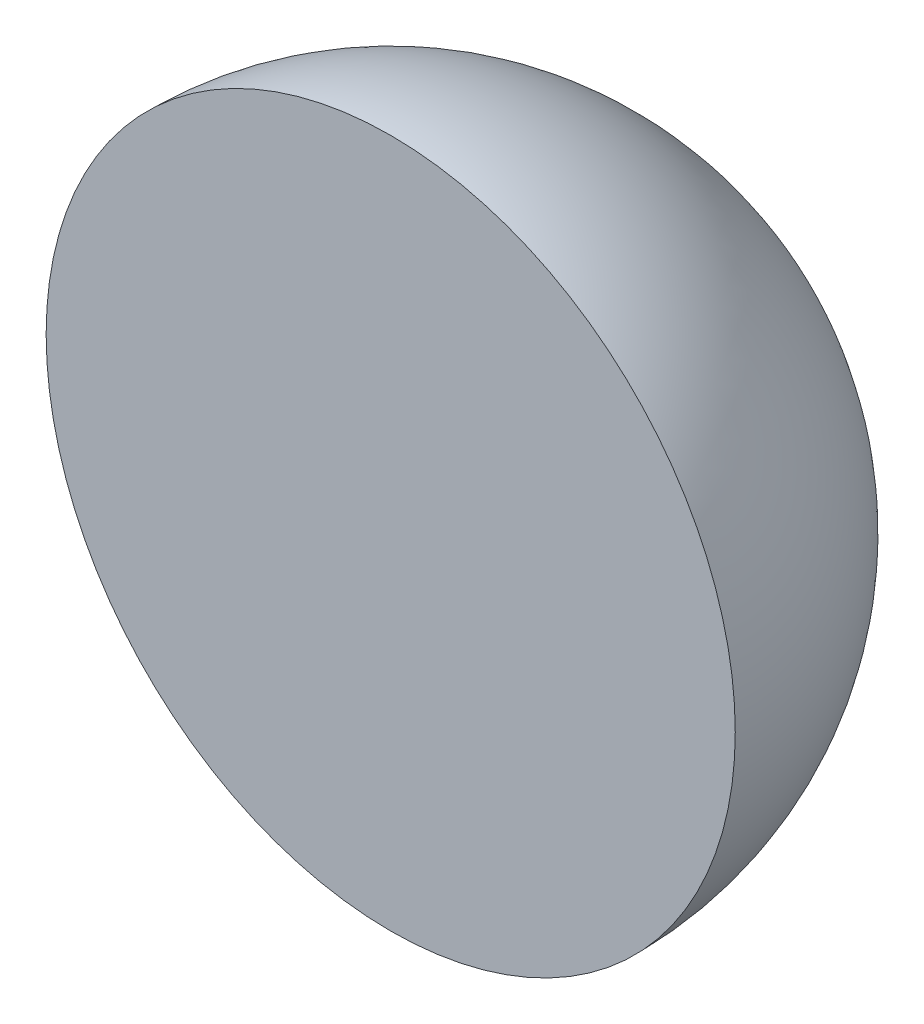
ISO-10303-21;
HEADER;
FILE_DESCRIPTION(('STEP AP214'),'2;1');
FILE_NAME('part.step','',(''),(''),'','','');
FILE_SCHEMA(('AUTOMOTIVE_DESIGN { 1 0 10303 214 1 1 1 1 }'));
ENDSEC;
DATA;
#1=APPLICATION_CONTEXT('core data for automotive mechanical design processes');
#2=APPLICATION_PROTOCOL_DEFINITION('international standard','automotive_design',2000,#1);
#3=PRODUCT_CONTEXT('',#1,'mechanical');
#4=PRODUCT('Part','Part','',(#3));
#5=PRODUCT_RELATED_PRODUCT_CATEGORY('part','',(#4));
#6=PRODUCT_DEFINITION_FORMATION('','',#4);
#7=PRODUCT_DEFINITION_CONTEXT('part definition',#1,'design');
#8=PRODUCT_DEFINITION('design','',#6,#7);
#9=PRODUCT_DEFINITION_SHAPE('','',#8);
#10=(LENGTH_UNIT() NAMED_UNIT(*) SI_UNIT(.MILLI.,.METRE.));
#11=(NAMED_UNIT(*) PLANE_ANGLE_UNIT() SI_UNIT($,.RADIAN.));
#12=(NAMED_UNIT(*) SI_UNIT($,.STERADIAN.) SOLID_ANGLE_UNIT());
#13=UNCERTAINTY_MEASURE_WITH_UNIT(LENGTH_MEASURE(1.E-05),#10,'distance_accuracy_value','');
#14=(GEOMETRIC_REPRESENTATION_CONTEXT(3) GLOBAL_UNCERTAINTY_ASSIGNED_CONTEXT((#13)) GLOBAL_UNIT_ASSIGNED_CONTEXT((#10,
#11,#12)) REPRESENTATION_CONTEXT('',''));
#15=CARTESIAN_POINT('',(0.,0.,0.));
#16=DIRECTION('',(0.,0.,1.));
#17=DIRECTION('',(1.,0.,0.));
#18=AXIS2_PLACEMENT_3D('',#15,#16,#17);
#19=CARTESIAN_POINT('',(0.,0.,0.));
#20=DIRECTION('',(0.,0.,-1.));
#21=DIRECTION('',(-1.,0.,0.));
#22=AXIS2_PLACEMENT_3D('',#19,#20,#21);
#23=PLANE('',#22);
#24=CARTESIAN_POINT('',(0.,0.,0.));
#25=DIRECTION('',(0.,0.,-1.));
#26=DIRECTION('',(-1.,0.,0.));
#27=AXIS2_PLACEMENT_3D('',#24,#25,#26);
#28=CIRCLE('',#27,42.);
#29=CARTESIAN_POINT('',(-42.,0.,0.));
#30=VERTEX_POINT('',#29);
#31=EDGE_CURVE('E10',#30,#30,#28,.T.);
#32=ORIENTED_EDGE('',*,*,#31,.F.);
#33=EDGE_LOOP('',(#32));
#34=FACE_BOUND('',#33,.T.);
#35=ADVANCED_FACE('F35',(#34),#23,.F.);
#36=CARTESIAN_POINT('',(0.,0.,0.));
#37=DIRECTION('',(0.,0.,-1.));
#38=DIRECTION('',(1.,0.,0.));
#39=AXIS2_PLACEMENT_3D('',#36,#37,#38);
#40=SPHERICAL_SURFACE('',#39,42.);
#41=ORIENTED_EDGE('',*,*,#31,.T.);
#42=EDGE_LOOP('',(#41));
#43=FACE_BOUND('',#42,.T.);
#44=ADVANCED_FACE('F42',(#43),#40,.T.);
#45=CLOSED_SHELL('',(#35,#44));
#46=MANIFOLD_SOLID_BREP('B2',#45);
#47=ADVANCED_BREP_SHAPE_REPRESENTATION('',(#18,#46),#14);
#48=SHAPE_DEFINITION_REPRESENTATION(#9,#47);
ENDSEC;
END-ISO-10303-21;
